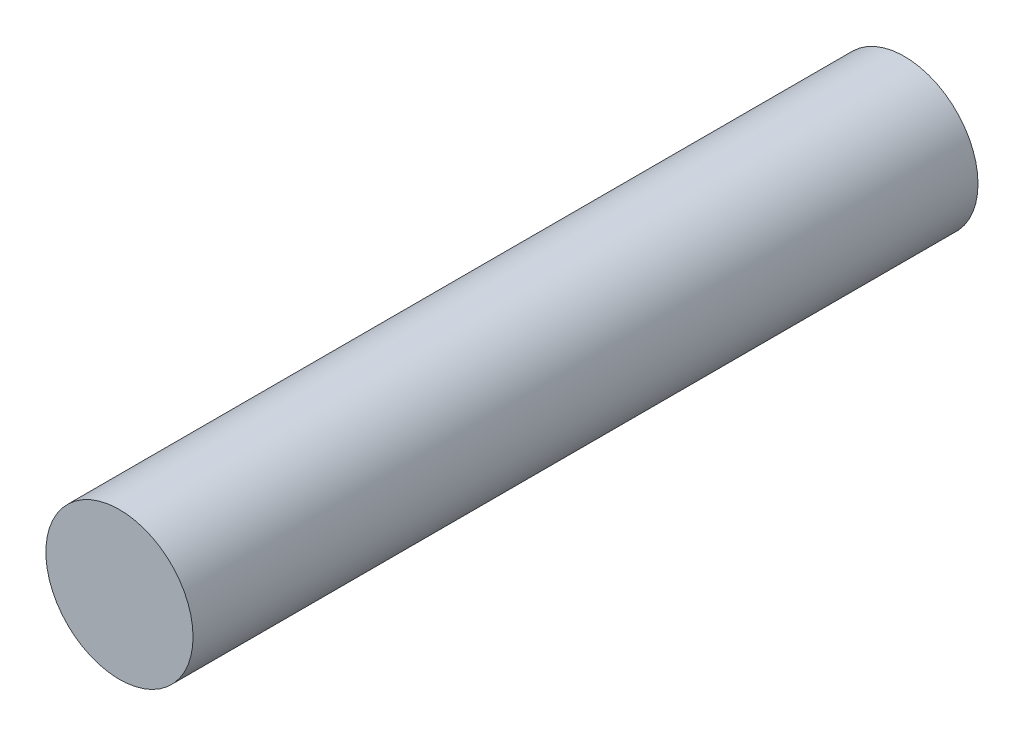
ISO-10303-21;
HEADER;
FILE_DESCRIPTION(('STEP AP214'),'2;1');
FILE_NAME('part.step','',(''),(''),'','','');
FILE_SCHEMA(('AUTOMOTIVE_DESIGN { 1 0 10303 214 1 1 1 1 }'));
ENDSEC;
DATA;
#1=APPLICATION_CONTEXT('core data for automotive mechanical design processes');
#2=APPLICATION_PROTOCOL_DEFINITION('international standard','automotive_design',2000,#1);
#3=PRODUCT_CONTEXT('',#1,'mechanical');
#4=PRODUCT('Part','Part','',(#3));
#5=PRODUCT_RELATED_PRODUCT_CATEGORY('part','',(#4));
#6=PRODUCT_DEFINITION_FORMATION('','',#4);
#7=PRODUCT_DEFINITION_CONTEXT('part definition',#1,'design');
#8=PRODUCT_DEFINITION('design','',#6,#7);
#9=PRODUCT_DEFINITION_SHAPE('','',#8);
#10=(LENGTH_UNIT() NAMED_UNIT(*) SI_UNIT(.MILLI.,.METRE.));
#11=(NAMED_UNIT(*) PLANE_ANGLE_UNIT() SI_UNIT($,.RADIAN.));
#12=(NAMED_UNIT(*) SI_UNIT($,.STERADIAN.) SOLID_ANGLE_UNIT());
#13=UNCERTAINTY_MEASURE_WITH_UNIT(LENGTH_MEASURE(1.E-05),#10,'distance_accuracy_value','');
#14=(GEOMETRIC_REPRESENTATION_CONTEXT(3) GLOBAL_UNCERTAINTY_ASSIGNED_CONTEXT((#13)) GLOBAL_UNIT_ASSIGNED_CONTEXT((#10,
#11,#12)) REPRESENTATION_CONTEXT('',''));
#15=CARTESIAN_POINT('',(0.,0.,0.));
#16=DIRECTION('',(0.,0.,1.));
#17=DIRECTION('',(1.,0.,0.));
#18=AXIS2_PLACEMENT_3D('',#15,#16,#17);
#19=CARTESIAN_POINT('',(0.,0.,50.8));
#20=DIRECTION('',(0.,0.,-1.));
#21=DIRECTION('',(-1.,0.,0.));
#22=AXIS2_PLACEMENT_3D('',#19,#20,#21);
#23=CYLINDRICAL_SURFACE('',#22,4.7625);
#24=CARTESIAN_POINT('',(0.,0.,50.8));
#25=DIRECTION('',(0.,0.,1.));
#26=DIRECTION('',(1.,0.,0.));
#27=AXIS2_PLACEMENT_3D('',#24,#25,#26);
#28=CIRCLE('',#27,4.7625);
#29=CARTESIAN_POINT('',(4.7625,0.,50.8));
#30=VERTEX_POINT('',#29);
#31=EDGE_CURVE('E10',#30,#30,#28,.T.);
#32=ORIENTED_EDGE('',*,*,#31,.F.);
#33=EDGE_LOOP('',(#32));
#34=FACE_BOUND('',#33,.T.);
#35=CARTESIAN_POINT('',(0.,0.,0.));
#36=DIRECTION('',(0.,0.,1.));
#37=DIRECTION('',(1.,0.,0.));
#38=AXIS2_PLACEMENT_3D('',#35,#36,#37);
#39=CIRCLE('',#38,4.7625);
#40=CARTESIAN_POINT('',(4.7625,0.,0.));
#41=VERTEX_POINT('',#40);
#42=EDGE_CURVE('E42',#41,#41,#39,.T.);
#43=ORIENTED_EDGE('',*,*,#42,.T.);
#44=EDGE_LOOP('',(#43));
#45=FACE_BOUND('',#44,.T.);
#46=ADVANCED_FACE('F39',(#34,#45),#23,.T.);
#47=CARTESIAN_POINT('',(0.,0.,50.8));
#48=DIRECTION('',(0.,0.,1.));
#49=DIRECTION('',(1.,0.,0.));
#50=AXIS2_PLACEMENT_3D('',#47,#48,#49);
#51=PLANE('',#50);
#52=ORIENTED_EDGE('',*,*,#31,.T.);
#53=EDGE_LOOP('',(#52));
#54=FACE_BOUND('',#53,.T.);
#55=ADVANCED_FACE('F54',(#54),#51,.T.);
#56=CARTESIAN_POINT('',(0.,0.,0.));
#57=DIRECTION('',(0.,0.,1.));
#58=DIRECTION('',(1.,0.,0.));
#59=AXIS2_PLACEMENT_3D('',#56,#57,#58);
#60=PLANE('',#59);
#61=ORIENTED_EDGE('',*,*,#42,.F.);
#62=EDGE_LOOP('',(#61));
#63=FACE_BOUND('',#62,.T.);
#64=ADVANCED_FACE('F52',(#63),#60,.F.);
#65=CLOSED_SHELL('',(#46,#55,#64));
#66=MANIFOLD_SOLID_BREP('B2',#65);
#67=ADVANCED_BREP_SHAPE_REPRESENTATION('',(#18,#66),#14);
#68=SHAPE_DEFINITION_REPRESENTATION(#9,#67);
ENDSEC;
END-ISO-10303-21;
